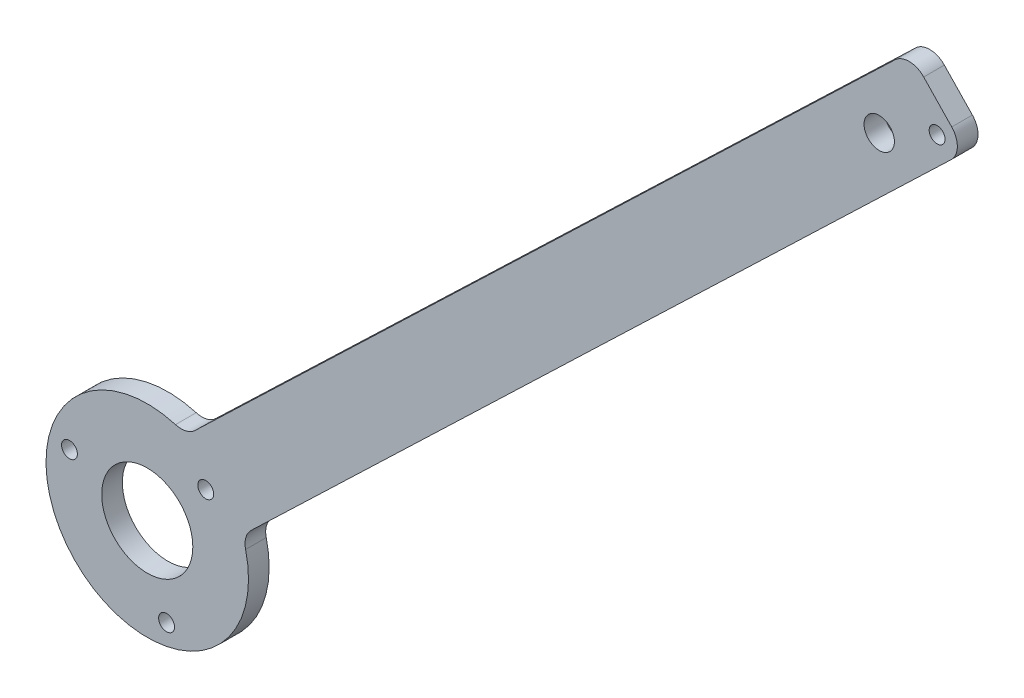
ISO-10303-21;
HEADER;
FILE_DESCRIPTION(('STEP AP214'),'2;1');
FILE_NAME('part.step','',(''),(''),'','','');
FILE_SCHEMA(('AUTOMOTIVE_DESIGN { 1 0 10303 214 1 1 1 1 }'));
ENDSEC;
DATA;
#1=APPLICATION_CONTEXT('core data for automotive mechanical design processes');
#2=APPLICATION_PROTOCOL_DEFINITION('international standard','automotive_design',2000,#1);
#3=PRODUCT_CONTEXT('',#1,'mechanical');
#4=PRODUCT('Part','Part','',(#3));
#5=PRODUCT_RELATED_PRODUCT_CATEGORY('part','',(#4));
#6=PRODUCT_DEFINITION_FORMATION('','',#4);
#7=PRODUCT_DEFINITION_CONTEXT('part definition',#1,'design');
#8=PRODUCT_DEFINITION('design','',#6,#7);
#9=PRODUCT_DEFINITION_SHAPE('','',#8);
#10=(LENGTH_UNIT() NAMED_UNIT(*) SI_UNIT(.MILLI.,.METRE.));
#11=(NAMED_UNIT(*) PLANE_ANGLE_UNIT() SI_UNIT($,.RADIAN.));
#12=(NAMED_UNIT(*) SI_UNIT($,.STERADIAN.) SOLID_ANGLE_UNIT());
#13=UNCERTAINTY_MEASURE_WITH_UNIT(LENGTH_MEASURE(1.E-05),#10,'distance_accuracy_value','');
#14=(GEOMETRIC_REPRESENTATION_CONTEXT(3) GLOBAL_UNCERTAINTY_ASSIGNED_CONTEXT((#13)) GLOBAL_UNIT_ASSIGNED_CONTEXT((#10,
#11,#12)) REPRESENTATION_CONTEXT('',''));
#15=CARTESIAN_POINT('',(0.,0.,0.));
#16=DIRECTION('',(0.,0.,1.));
#17=DIRECTION('',(1.,0.,0.));
#18=AXIS2_PLACEMENT_3D('',#15,#16,#17);
#19=CARTESIAN_POINT('',(-33.5603970092838,35.0099470933595,6.477));
#20=DIRECTION('',(0.692004216984368,-0.721893457288437,0.));
#21=DIRECTION('',(0.721893457288437,0.692004216984368,0.));
#22=AXIS2_PLACEMENT_3D('',#19,#20,#21);
#23=PLANE('',#22);
#24=DIRECTION('',(-0.721893457288437,-0.692004216984368,0.));
#25=VECTOR('',#24,1.);
#26=CARTESIAN_POINT('',(-33.5603970092838,35.0099470933595,6.477));
#27=LINE('',#26,#25);
#28=CARTESIAN_POINT('',(818.667319666593,851.952070361599,6.477));
#29=VERTEX_POINT('',#28);
#30=CARTESIAN_POINT('',(599.230831019419,641.601119025281,6.477));
#31=VERTEX_POINT('',#30);
#32=EDGE_CURVE('E124',#29,#31,#27,.T.);
#33=ORIENTED_EDGE('',*,*,#32,.F.);
#34=DIRECTION('',(0.,0.,-1.));
#35=VECTOR('',#34,1.);
#36=CARTESIAN_POINT('',(818.667319666592,851.952070361599,0.));
#37=LINE('',#36,#35);
#38=CARTESIAN_POINT('',(818.667319666593,851.952070361599,0.));
#39=VERTEX_POINT('',#38);
#40=EDGE_CURVE('E109',#29,#39,#37,.T.);
#41=ORIENTED_EDGE('',*,*,#40,.T.);
#42=DIRECTION('',(-0.721893457288437,-0.692004216984368,0.));
#43=VECTOR('',#42,1.);
#44=CARTESIAN_POINT('',(-33.5603970092838,35.0099470933595,0.));
#45=LINE('',#44,#43);
#46=CARTESIAN_POINT('',(599.230831019419,641.601119025281,0.));
#47=VERTEX_POINT('',#46);
#48=EDGE_CURVE('E121',#39,#47,#45,.T.);
#49=ORIENTED_EDGE('',*,*,#48,.T.);
#50=DIRECTION('',(0.,0.,1.));
#51=VECTOR('',#50,1.);
#52=CARTESIAN_POINT('',(599.230831019419,641.601119025281,6.477));
#53=LINE('',#52,#51);
#54=EDGE_CURVE('E125',#47,#31,#53,.T.);
#55=ORIENTED_EDGE('',*,*,#54,.T.);
#56=EDGE_LOOP('',(#33,#41,#49,#55));
#57=FACE_BOUND('',#56,.T.);
#58=ADVANCED_FACE('F39',(#57),#23,.F.);
#59=CARTESIAN_POINT('',(584.20000000001,609.600000000067,6.477));
#60=DIRECTION('',(0.,0.,-1.));
#61=DIRECTION('',(-1.,0.,0.));
#62=AXIS2_PLACEMENT_3D('',#59,#60,#61);
#63=CYLINDRICAL_SURFACE('',#62,31.75);
#64=CARTESIAN_POINT('',(584.20000000001,609.600000000067,0.));
#65=DIRECTION('',(0.,0.,1.));
#66=DIRECTION('',(1.,0.,0.));
#67=AXIS2_PLACEMENT_3D('',#64,#65,#66);
#68=CIRCLE('',#67,31.75);
#69=CARTESIAN_POINT('',(593.063836867976,640.087618732564,0.));
#70=VERTEX_POINT('',#69);
#71=CARTESIAN_POINT('',(615.034970757229,617.167501463655,0.));
#72=VERTEX_POINT('',#71);
#73=EDGE_CURVE('E130',#70,#72,#68,.T.);
#74=ORIENTED_EDGE('',*,*,#73,.T.);
#75=DIRECTION('',(0.,0.,-1.));
#76=VECTOR('',#75,1.);
#77=CARTESIAN_POINT('',(615.034970757229,617.167501463655,6.477));
#78=LINE('',#77,#76);
#79=CARTESIAN_POINT('',(615.034970757229,617.167501463655,6.477));
#80=VERTEX_POINT('',#79);
#81=EDGE_CURVE('E166',#72,#80,#78,.F.);
#82=ORIENTED_EDGE('',*,*,#81,.T.);
#83=CARTESIAN_POINT('',(584.20000000001,609.600000000067,6.477));
#84=DIRECTION('',(0.,0.,1.));
#85=DIRECTION('',(1.,0.,0.));
#86=AXIS2_PLACEMENT_3D('',#83,#84,#85);
#87=CIRCLE('',#86,31.75);
#88=CARTESIAN_POINT('',(593.063836867976,640.087618732564,6.477));
#89=VERTEX_POINT('',#88);
#90=EDGE_CURVE('E182',#89,#80,#87,.T.);
#91=ORIENTED_EDGE('',*,*,#90,.F.);
#92=DIRECTION('',(0.,0.,-1.));
#93=VECTOR('',#92,1.);
#94=CARTESIAN_POINT('',(593.063836867976,640.087618732564,6.477));
#95=LINE('',#94,#93);
#96=EDGE_CURVE('E163',#89,#70,#95,.T.);
#97=ORIENTED_EDGE('',*,*,#96,.T.);
#98=EDGE_LOOP('',(#74,#82,#91,#97));
#99=FACE_BOUND('',#98,.T.);
#100=ADVANCED_FACE('F174',(#99),#63,.T.);
#101=CARTESIAN_POINT('',(-15.9834898978804,16.6738532782327,6.477));
#102=DIRECTION('',(0.692004216984368,-0.721893457288436,0.));
#103=DIRECTION('',(0.721893457288436,0.692004216984368,0.));
#104=AXIS2_PLACEMENT_3D('',#101,#102,#103);
#105=PLANE('',#104);
#106=DIRECTION('',(-0.721893457288436,-0.692004216984368,0.));
#107=VECTOR('',#106,1.);
#108=CARTESIAN_POINT('',(-15.9834898978804,16.6738532782327,0.));
#109=LINE('',#108,#107);
#110=CARTESIAN_POINT('',(836.244226777996,833.615976546473,0.));
#111=VERTEX_POINT('',#110);
#112=CARTESIAN_POINT('',(616.807738130823,623.265025210155,0.));
#113=VERTEX_POINT('',#112);
#114=EDGE_CURVE('E134',#111,#113,#109,.T.);
#115=ORIENTED_EDGE('',*,*,#114,.F.);
#116=DIRECTION('',(0.,0.,-1.));
#117=VECTOR('',#116,1.);
#118=CARTESIAN_POINT('',(836.244226777996,833.615976546473,6.477));
#119=LINE('',#118,#117);
#120=CARTESIAN_POINT('',(836.244226777996,833.615976546473,6.477));
#121=VERTEX_POINT('',#120);
#122=EDGE_CURVE('E61',#111,#121,#119,.F.);
#123=ORIENTED_EDGE('',*,*,#122,.T.);
#124=DIRECTION('',(-0.721893457288436,-0.692004216984368,0.));
#125=VECTOR('',#124,1.);
#126=CARTESIAN_POINT('',(-15.9834898978804,16.6738532782327,6.477));
#127=LINE('',#126,#125);
#128=CARTESIAN_POINT('',(616.807738130823,623.265025210155,6.477));
#129=VERTEX_POINT('',#128);
#130=EDGE_CURVE('E179',#121,#129,#127,.T.);
#131=ORIENTED_EDGE('',*,*,#130,.T.);
#132=DIRECTION('',(0.,0.,-1.));
#133=VECTOR('',#132,1.);
#134=CARTESIAN_POINT('',(616.807738130823,623.265025210155,6.477));
#135=LINE('',#134,#133);
#136=EDGE_CURVE('E159',#129,#113,#135,.T.);
#137=ORIENTED_EDGE('',*,*,#136,.T.);
#138=EDGE_LOOP('',(#115,#123,#131,#137));
#139=FACE_BOUND('',#138,.T.);
#140=ADVANCED_FACE('F178',(#139),#105,.T.);
#141=CARTESIAN_POINT('',(856.811740129658,821.336350046091,6.477));
#142=DIRECTION('',(0.721893457288436,0.692004216984368,0.));
#143=DIRECTION('',(-0.692004216984368,0.721893457288436,0.));
#144=AXIS2_PLACEMENT_3D('',#141,#142,#143);
#145=PLANE('',#144);
#146=DIRECTION('',(0.692004216984368,-0.721893457288436,0.));
#147=VECTOR('',#146,1.);
#148=CARTESIAN_POINT('',(856.811740129658,821.336350046091,0.));
#149=LINE('',#148,#147);
#150=CARTESIAN_POINT('',(827.645569898225,851.762273685668,0.));
#151=VERTEX_POINT('',#150);
#152=CARTESIAN_POINT('',(836.434023453926,842.594226778105,0.));
#153=VERTEX_POINT('',#152);
#154=EDGE_CURVE('E145',#151,#153,#149,.T.);
#155=ORIENTED_EDGE('',*,*,#154,.F.);
#156=DIRECTION('',(0.,0.,-1.));
#157=VECTOR('',#156,1.);
#158=CARTESIAN_POINT('',(827.645569898225,851.762273685668,6.477));
#159=LINE('',#158,#157);
#160=CARTESIAN_POINT('',(827.645569898225,851.762273685668,6.477));
#161=VERTEX_POINT('',#160);
#162=EDGE_CURVE('E110',#151,#161,#159,.F.);
#163=ORIENTED_EDGE('',*,*,#162,.T.);
#164=DIRECTION('',(0.692004216984368,-0.721893457288436,0.));
#165=VECTOR('',#164,1.);
#166=CARTESIAN_POINT('',(856.811740129658,821.336350046091,6.477));
#167=LINE('',#166,#165);
#168=CARTESIAN_POINT('',(836.434023453926,842.594226778105,6.477));
#169=VERTEX_POINT('',#168);
#170=EDGE_CURVE('E181',#161,#169,#167,.T.);
#171=ORIENTED_EDGE('',*,*,#170,.T.);
#172=DIRECTION('',(0.,0.,-1.));
#173=VECTOR('',#172,1.);
#174=CARTESIAN_POINT('',(836.434023453926,842.594226778105,6.477));
#175=LINE('',#174,#173);
#176=EDGE_CURVE('E115',#169,#153,#175,.T.);
#177=ORIENTED_EDGE('',*,*,#176,.T.);
#178=EDGE_LOOP('',(#155,#163,#171,#177));
#179=FACE_BOUND('',#178,.T.);
#180=ADVANCED_FACE('F259',(#179),#145,.T.);
#181=CARTESIAN_POINT('',(584.20000000001,609.600000000067,6.477));
#182=DIRECTION('',(0.,0.,-1.));
#183=DIRECTION('',(-1.,0.,0.));
#184=AXIS2_PLACEMENT_3D('',#181,#182,#183);
#185=CYLINDRICAL_SURFACE('',#184,14.2875000000112);
#186=CARTESIAN_POINT('',(584.20000000001,609.600000000067,6.477));
#187=DIRECTION('',(0.,0.,1.));
#188=DIRECTION('',(1.,0.,0.));
#189=AXIS2_PLACEMENT_3D('',#186,#187,#188);
#190=CIRCLE('',#189,14.2875000000112);
#191=CARTESIAN_POINT('',(598.487500000021,609.600000000067,6.477));
#192=VERTEX_POINT('',#191);
#193=EDGE_CURVE('E140',#192,#192,#190,.T.);
#194=ORIENTED_EDGE('',*,*,#193,.T.);
#195=EDGE_LOOP('',(#194));
#196=FACE_BOUND('',#195,.T.);
#197=CARTESIAN_POINT('',(584.20000000001,609.600000000067,0.));
#198=DIRECTION('',(0.,0.,1.));
#199=DIRECTION('',(1.,0.,0.));
#200=AXIS2_PLACEMENT_3D('',#197,#198,#199);
#201=CIRCLE('',#200,14.2875000000112);
#202=CARTESIAN_POINT('',(598.487500000021,609.600000000067,0.));
#203=VERTEX_POINT('',#202);
#204=EDGE_CURVE('E147',#203,#203,#201,.T.);
#205=ORIENTED_EDGE('',*,*,#204,.F.);
#206=EDGE_LOOP('',(#205));
#207=FACE_BOUND('',#206,.T.);
#208=ADVANCED_FACE('F261',(#196,#207),#185,.F.);
#209=CARTESIAN_POINT('',(0.,0.,6.477));
#210=DIRECTION('',(0.,0.,1.));
#211=DIRECTION('',(1.,0.,0.));
#212=AXIS2_PLACEMENT_3D('',#209,#210,#211);
#213=PLANE('',#212);
#214=CARTESIAN_POINT('',(559.809905014012,616.691069494439,6.477));
#215=DIRECTION('',(0.,0.,1.));
#216=DIRECTION('',(1.,0.,0.));
#217=AXIS2_PLACEMENT_3D('',#214,#215,#216);
#218=CIRCLE('',#217,2.48919999999959);
#219=CARTESIAN_POINT('',(562.299105014012,616.691069494439,6.477));
#220=VERTEX_POINT('',#219);
#221=EDGE_CURVE('E198',#220,#220,#218,.T.);
#222=ORIENTED_EDGE('',*,*,#221,.F.);
#223=EDGE_LOOP('',(#222));
#224=FACE_BOUND('',#223,.T.);
#225=CARTESIAN_POINT('',(831.849999999918,838.2,6.477));
#226=DIRECTION('',(0.,0.,1.));
#227=DIRECTION('',(1.,0.,0.));
#228=AXIS2_PLACEMENT_3D('',#225,#226,#227);
#229=CIRCLE('',#228,2.48919999999994);
#230=CARTESIAN_POINT('',(834.339199999918,838.2,6.477));
#231=VERTEX_POINT('',#230);
#232=EDGE_CURVE('E191',#231,#231,#229,.T.);
#233=ORIENTED_EDGE('',*,*,#232,.F.);
#234=EDGE_LOOP('',(#233));
#235=FACE_BOUND('',#234,.T.);
#236=CARTESIAN_POINT('',(602.536093815136,627.176907111469,6.477));
#237=DIRECTION('',(0.,0.,1.));
#238=DIRECTION('',(1.,0.,0.));
#239=AXIS2_PLACEMENT_3D('',#236,#237,#238);
#240=CIRCLE('',#239,2.48919999999983);
#241=CARTESIAN_POINT('',(605.025293815136,627.176907111469,6.477));
#242=VERTEX_POINT('',#241);
#243=EDGE_CURVE('E209',#242,#242,#240,.T.);
#244=ORIENTED_EDGE('',*,*,#243,.F.);
#245=EDGE_LOOP('',(#244));
#246=FACE_BOUND('',#245,.T.);
#247=CARTESIAN_POINT('',(590.254001170881,584.932023394291,6.477));
#248=DIRECTION('',(0.,0.,1.));
#249=DIRECTION('',(1.,0.,0.));
#250=AXIS2_PLACEMENT_3D('',#247,#248,#249);
#251=CIRCLE('',#250,2.48920000000029);
#252=CARTESIAN_POINT('',(592.743201170881,584.932023394291,6.477));
#253=VERTEX_POINT('',#252);
#254=EDGE_CURVE('E203',#253,#253,#251,.T.);
#255=ORIENTED_EDGE('',*,*,#254,.F.);
#256=EDGE_LOOP('',(#255));
#257=FACE_BOUND('',#256,.T.);
#258=CARTESIAN_POINT('',(813.703702860951,829.601343120483,6.477));
#259=DIRECTION('',(0.,0.,1.));
#260=DIRECTION('',(1.,0.,0.));
#261=AXIS2_PLACEMENT_3D('',#258,#259,#260);
#262=CIRCLE('',#261,4.76249999999917);
#263=CARTESIAN_POINT('',(818.46620286095,829.601343120483,6.477));
#264=VERTEX_POINT('',#263);
#265=EDGE_CURVE('E131',#264,#264,#262,.T.);
#266=ORIENTED_EDGE('',*,*,#265,.F.);
#267=EDGE_LOOP('',(#266));
#268=FACE_BOUND('',#267,.T.);
#269=ORIENTED_EDGE('',*,*,#170,.F.);
#270=CARTESIAN_POINT('',(823.061546444443,847.368046907818,6.477));
#271=DIRECTION('',(0.,0.,1.));
#272=DIRECTION('',(1.,0.,0.));
#273=AXIS2_PLACEMENT_3D('',#270,#271,#272);
#274=CIRCLE('',#273,6.35);
#275=EDGE_CURVE('E157',#161,#29,#274,.T.);
#276=ORIENTED_EDGE('',*,*,#275,.T.);
#277=ORIENTED_EDGE('',*,*,#32,.T.);
#278=CARTESIAN_POINT('',(594.836604241569,646.185142479063,6.477));
#279=DIRECTION('',(0.,0.,1.));
#280=DIRECTION('',(1.,0.,0.));
#281=AXIS2_PLACEMENT_3D('',#278,#279,#280);
#282=CIRCLE('',#281,6.35);
#283=EDGE_CURVE('E11',#31,#89,#282,.F.);
#284=ORIENTED_EDGE('',*,*,#283,.T.);
#285=ORIENTED_EDGE('',*,*,#90,.T.);
#286=CARTESIAN_POINT('',(621.201964908673,618.681001756373,6.477));
#287=DIRECTION('',(0.,0.,1.));
#288=DIRECTION('',(1.,0.,0.));
#289=AXIS2_PLACEMENT_3D('',#286,#287,#288);
#290=CIRCLE('',#289,6.35);
#291=EDGE_CURVE('E54',#80,#129,#290,.F.);
#292=ORIENTED_EDGE('',*,*,#291,.T.);
#293=ORIENTED_EDGE('',*,*,#130,.F.);
#294=CARTESIAN_POINT('',(831.850000000145,838.200000000254,6.477));
#295=DIRECTION('',(0.,0.,1.));
#296=DIRECTION('',(1.,0.,0.));
#297=AXIS2_PLACEMENT_3D('',#294,#295,#296);
#298=CIRCLE('',#297,6.35);
#299=EDGE_CURVE('E155',#121,#169,#298,.T.);
#300=ORIENTED_EDGE('',*,*,#299,.T.);
#301=EDGE_LOOP('',(#269,#276,#277,#284,#285,#292,#293,#300));
#302=FACE_BOUND('',#301,.T.);
#303=ORIENTED_EDGE('',*,*,#193,.F.);
#304=EDGE_LOOP('',(#303));
#305=FACE_BOUND('',#304,.T.);
#306=ADVANCED_FACE('F255',(#224,#235,#246,#257,#268,#302,#305),#213,.T.);
#307=CARTESIAN_POINT('',(0.,0.,0.));
#308=DIRECTION('',(0.,0.,1.));
#309=DIRECTION('',(1.,0.,0.));
#310=AXIS2_PLACEMENT_3D('',#307,#308,#309);
#311=PLANE('',#310);
#312=CARTESIAN_POINT('',(559.809905014012,616.691069494439,0.));
#313=DIRECTION('',(0.,0.,1.));
#314=DIRECTION('',(1.,0.,0.));
#315=AXIS2_PLACEMENT_3D('',#312,#313,#314);
#316=CIRCLE('',#315,2.48919999999959);
#317=CARTESIAN_POINT('',(562.299105014012,616.691069494439,0.));
#318=VERTEX_POINT('',#317);
#319=EDGE_CURVE('E189',#318,#318,#316,.T.);
#320=ORIENTED_EDGE('',*,*,#319,.T.);
#321=EDGE_LOOP('',(#320));
#322=FACE_BOUND('',#321,.T.);
#323=CARTESIAN_POINT('',(831.849999999918,838.2,0.));
#324=DIRECTION('',(0.,0.,1.));
#325=DIRECTION('',(1.,0.,0.));
#326=AXIS2_PLACEMENT_3D('',#323,#324,#325);
#327=CIRCLE('',#326,2.48919999999994);
#328=CARTESIAN_POINT('',(834.339199999918,838.2,0.));
#329=VERTEX_POINT('',#328);
#330=EDGE_CURVE('E194',#329,#329,#327,.T.);
#331=ORIENTED_EDGE('',*,*,#330,.T.);
#332=EDGE_LOOP('',(#331));
#333=FACE_BOUND('',#332,.T.);
#334=CARTESIAN_POINT('',(602.536093815136,627.176907111469,0.));
#335=DIRECTION('',(0.,0.,1.));
#336=DIRECTION('',(1.,0.,0.));
#337=AXIS2_PLACEMENT_3D('',#334,#335,#336);
#338=CIRCLE('',#337,2.48919999999983);
#339=CARTESIAN_POINT('',(605.025293815136,627.176907111469,0.));
#340=VERTEX_POINT('',#339);
#341=EDGE_CURVE('E195',#340,#340,#338,.T.);
#342=ORIENTED_EDGE('',*,*,#341,.T.);
#343=EDGE_LOOP('',(#342));
#344=FACE_BOUND('',#343,.T.);
#345=CARTESIAN_POINT('',(590.254001170881,584.932023394291,0.));
#346=DIRECTION('',(0.,0.,1.));
#347=DIRECTION('',(1.,0.,0.));
#348=AXIS2_PLACEMENT_3D('',#345,#346,#347);
#349=CIRCLE('',#348,2.48920000000029);
#350=CARTESIAN_POINT('',(592.743201170881,584.932023394291,0.));
#351=VERTEX_POINT('',#350);
#352=EDGE_CURVE('E206',#351,#351,#349,.T.);
#353=ORIENTED_EDGE('',*,*,#352,.T.);
#354=EDGE_LOOP('',(#353));
#355=FACE_BOUND('',#354,.T.);
#356=CARTESIAN_POINT('',(813.703702860951,829.601343120483,0.));
#357=DIRECTION('',(0.,0.,1.));
#358=DIRECTION('',(1.,0.,0.));
#359=AXIS2_PLACEMENT_3D('',#356,#357,#358);
#360=CIRCLE('',#359,4.76249999999917);
#361=CARTESIAN_POINT('',(818.46620286095,829.601343120483,0.));
#362=VERTEX_POINT('',#361);
#363=EDGE_CURVE('E137',#362,#362,#360,.T.);
#364=ORIENTED_EDGE('',*,*,#363,.T.);
#365=EDGE_LOOP('',(#364));
#366=FACE_BOUND('',#365,.T.);
#367=ORIENTED_EDGE('',*,*,#48,.F.);
#368=CARTESIAN_POINT('',(823.061546444443,847.368046907818,0.));
#369=DIRECTION('',(0.,0.,1.));
#370=DIRECTION('',(1.,0.,0.));
#371=AXIS2_PLACEMENT_3D('',#368,#369,#370);
#372=CIRCLE('',#371,6.35);
#373=EDGE_CURVE('E105',#39,#151,#372,.F.);
#374=ORIENTED_EDGE('',*,*,#373,.T.);
#375=ORIENTED_EDGE('',*,*,#154,.T.);
#376=CARTESIAN_POINT('',(831.850000000145,838.200000000254,0.));
#377=DIRECTION('',(0.,0.,1.));
#378=DIRECTION('',(1.,0.,0.));
#379=AXIS2_PLACEMENT_3D('',#376,#377,#378);
#380=CIRCLE('',#379,6.35);
#381=EDGE_CURVE('E116',#153,#111,#380,.F.);
#382=ORIENTED_EDGE('',*,*,#381,.T.);
#383=ORIENTED_EDGE('',*,*,#114,.T.);
#384=CARTESIAN_POINT('',(621.201964908673,618.681001756373,0.));
#385=DIRECTION('',(0.,0.,1.));
#386=DIRECTION('',(1.,0.,0.));
#387=AXIS2_PLACEMENT_3D('',#384,#385,#386);
#388=CIRCLE('',#387,6.35);
#389=EDGE_CURVE('E168',#113,#72,#388,.T.);
#390=ORIENTED_EDGE('',*,*,#389,.T.);
#391=ORIENTED_EDGE('',*,*,#73,.F.);
#392=CARTESIAN_POINT('',(594.836604241569,646.185142479063,0.));
#393=DIRECTION('',(0.,0.,1.));
#394=DIRECTION('',(1.,0.,0.));
#395=AXIS2_PLACEMENT_3D('',#392,#393,#394);
#396=CIRCLE('',#395,6.35);
#397=EDGE_CURVE('E47',#70,#47,#396,.T.);
#398=ORIENTED_EDGE('',*,*,#397,.T.);
#399=EDGE_LOOP('',(#367,#374,#375,#382,#383,#390,#391,#398));
#400=FACE_BOUND('',#399,.T.);
#401=ORIENTED_EDGE('',*,*,#204,.T.);
#402=EDGE_LOOP('',(#401));
#403=FACE_BOUND('',#402,.T.);
#404=ADVANCED_FACE('F127',(#322,#333,#344,#355,#366,#400,#403),#311,.F.);
#405=CARTESIAN_POINT('',(813.703702860951,829.601343120483,6.477));
#406=DIRECTION('',(0.,0.,-1.));
#407=DIRECTION('',(-1.,0.,0.));
#408=AXIS2_PLACEMENT_3D('',#405,#406,#407);
#409=CYLINDRICAL_SURFACE('',#408,4.76249999999917);
#410=ORIENTED_EDGE('',*,*,#265,.T.);
#411=EDGE_LOOP('',(#410));
#412=FACE_BOUND('',#411,.T.);
#413=ORIENTED_EDGE('',*,*,#363,.F.);
#414=EDGE_LOOP('',(#413));
#415=FACE_BOUND('',#414,.T.);
#416=ADVANCED_FACE('F230',(#412,#415),#409,.F.);
#417=CARTESIAN_POINT('',(590.254001170881,584.932023394291,6.477));
#418=DIRECTION('',(0.,0.,-1.));
#419=DIRECTION('',(-1.,0.,0.));
#420=AXIS2_PLACEMENT_3D('',#417,#418,#419);
#421=CYLINDRICAL_SURFACE('',#420,2.48920000000029);
#422=ORIENTED_EDGE('',*,*,#254,.T.);
#423=EDGE_LOOP('',(#422));
#424=FACE_BOUND('',#423,.T.);
#425=ORIENTED_EDGE('',*,*,#352,.F.);
#426=EDGE_LOOP('',(#425));
#427=FACE_BOUND('',#426,.T.);
#428=ADVANCED_FACE('F220',(#424,#427),#421,.F.);
#429=CARTESIAN_POINT('',(602.536093815136,627.176907111469,6.477));
#430=DIRECTION('',(0.,0.,-1.));
#431=DIRECTION('',(-1.,0.,0.));
#432=AXIS2_PLACEMENT_3D('',#429,#430,#431);
#433=CYLINDRICAL_SURFACE('',#432,2.48919999999983);
#434=ORIENTED_EDGE('',*,*,#243,.T.);
#435=EDGE_LOOP('',(#434));
#436=FACE_BOUND('',#435,.T.);
#437=ORIENTED_EDGE('',*,*,#341,.F.);
#438=EDGE_LOOP('',(#437));
#439=FACE_BOUND('',#438,.T.);
#440=ADVANCED_FACE('F217',(#436,#439),#433,.F.);
#441=CARTESIAN_POINT('',(831.849999999918,838.2,6.477));
#442=DIRECTION('',(0.,0.,-1.));
#443=DIRECTION('',(-1.,0.,0.));
#444=AXIS2_PLACEMENT_3D('',#441,#442,#443);
#445=CYLINDRICAL_SURFACE('',#444,2.48919999999994);
#446=ORIENTED_EDGE('',*,*,#232,.T.);
#447=EDGE_LOOP('',(#446));
#448=FACE_BOUND('',#447,.T.);
#449=ORIENTED_EDGE('',*,*,#330,.F.);
#450=EDGE_LOOP('',(#449));
#451=FACE_BOUND('',#450,.T.);
#452=ADVANCED_FACE('F219',(#448,#451),#445,.F.);
#453=CARTESIAN_POINT('',(559.809905014012,616.691069494439,6.477));
#454=DIRECTION('',(0.,0.,-1.));
#455=DIRECTION('',(-1.,0.,0.));
#456=AXIS2_PLACEMENT_3D('',#453,#454,#455);
#457=CYLINDRICAL_SURFACE('',#456,2.48919999999959);
#458=ORIENTED_EDGE('',*,*,#221,.T.);
#459=EDGE_LOOP('',(#458));
#460=FACE_BOUND('',#459,.T.);
#461=ORIENTED_EDGE('',*,*,#319,.F.);
#462=EDGE_LOOP('',(#461));
#463=FACE_BOUND('',#462,.T.);
#464=ADVANCED_FACE('F227',(#460,#463),#457,.F.);
#465=CARTESIAN_POINT('',(823.061546444443,847.368046907818,6.477));
#466=DIRECTION('',(0.,0.,1.));
#467=DIRECTION('',(1.,0.,0.));
#468=AXIS2_PLACEMENT_3D('',#465,#466,#467);
#469=CYLINDRICAL_SURFACE('',#468,6.35);
#470=ORIENTED_EDGE('',*,*,#275,.F.);
#471=ORIENTED_EDGE('',*,*,#162,.F.);
#472=ORIENTED_EDGE('',*,*,#373,.F.);
#473=ORIENTED_EDGE('',*,*,#40,.F.);
#474=EDGE_LOOP('',(#470,#471,#472,#473));
#475=FACE_BOUND('',#474,.T.);
#476=ADVANCED_FACE('F108',(#475),#469,.T.);
#477=CARTESIAN_POINT('',(831.850000000145,838.200000000254,6.477));
#478=DIRECTION('',(0.,0.,-1.));
#479=DIRECTION('',(-1.,0.,0.));
#480=AXIS2_PLACEMENT_3D('',#477,#478,#479);
#481=CYLINDRICAL_SURFACE('',#480,6.35);
#482=ORIENTED_EDGE('',*,*,#299,.F.);
#483=ORIENTED_EDGE('',*,*,#122,.F.);
#484=ORIENTED_EDGE('',*,*,#381,.F.);
#485=ORIENTED_EDGE('',*,*,#176,.F.);
#486=EDGE_LOOP('',(#482,#483,#484,#485));
#487=FACE_BOUND('',#486,.T.);
#488=ADVANCED_FACE('F243',(#487),#481,.T.);
#489=CARTESIAN_POINT('',(621.201964908673,618.681001756373,6.477));
#490=DIRECTION('',(0.,0.,-1.));
#491=DIRECTION('',(-1.,0.,0.));
#492=AXIS2_PLACEMENT_3D('',#489,#490,#491);
#493=CYLINDRICAL_SURFACE('',#492,6.35);
#494=ORIENTED_EDGE('',*,*,#291,.F.);
#495=ORIENTED_EDGE('',*,*,#81,.F.);
#496=ORIENTED_EDGE('',*,*,#389,.F.);
#497=ORIENTED_EDGE('',*,*,#136,.F.);
#498=EDGE_LOOP('',(#494,#495,#496,#497));
#499=FACE_BOUND('',#498,.T.);
#500=ADVANCED_FACE('F177',(#499),#493,.F.);
#501=CARTESIAN_POINT('',(594.836604241569,646.185142479063,6.477));
#502=DIRECTION('',(0.,0.,-1.));
#503=DIRECTION('',(-1.,0.,0.));
#504=AXIS2_PLACEMENT_3D('',#501,#502,#503);
#505=CYLINDRICAL_SURFACE('',#504,6.35);
#506=ORIENTED_EDGE('',*,*,#283,.F.);
#507=ORIENTED_EDGE('',*,*,#54,.F.);
#508=ORIENTED_EDGE('',*,*,#397,.F.);
#509=ORIENTED_EDGE('',*,*,#96,.F.);
#510=EDGE_LOOP('',(#506,#507,#508,#509));
#511=FACE_BOUND('',#510,.T.);
#512=ADVANCED_FACE('F41',(#511),#505,.F.);
#513=CLOSED_SHELL('',(#58,#100,#140,#180,#208,#306,#404,#416,#428,#440,#452,#464,#476,#488,#500,#512));
#514=MANIFOLD_SOLID_BREP('B2',#513);
#515=ADVANCED_BREP_SHAPE_REPRESENTATION('',(#18,#514),#14);
#516=SHAPE_DEFINITION_REPRESENTATION(#9,#515);
ENDSEC;
END-ISO-10303-21;
